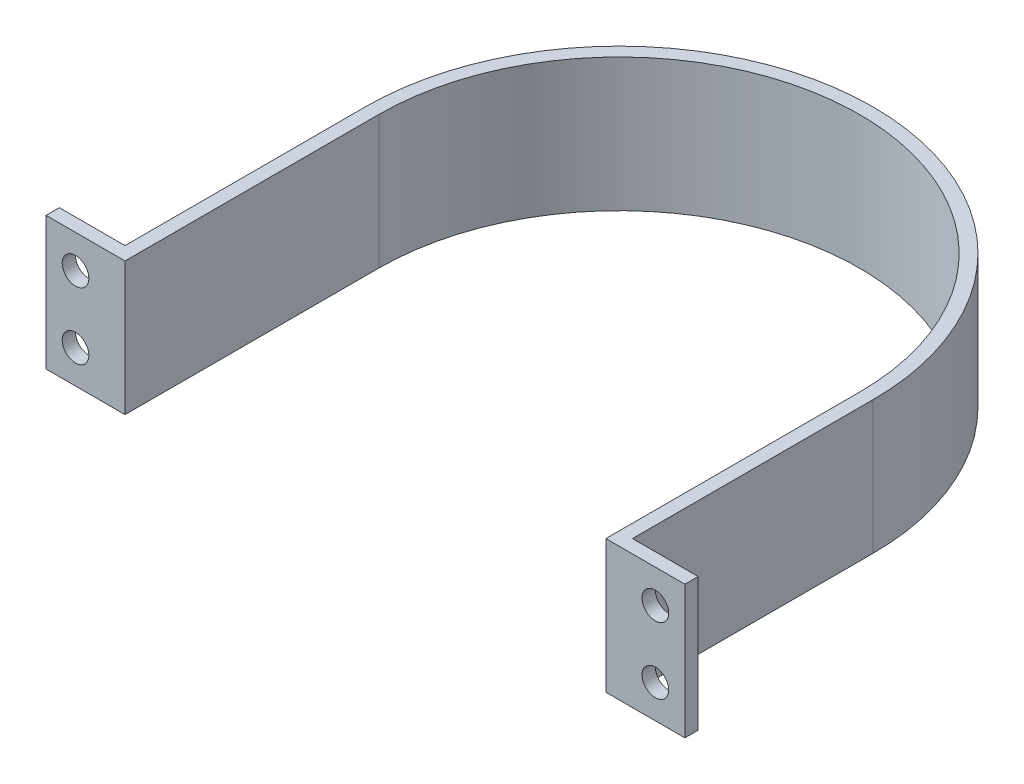
ISO-10303-21;
HEADER;
FILE_DESCRIPTION(('STEP AP214'),'2;1');
FILE_NAME('part.step','',(''),(''),'','','');
FILE_SCHEMA(('AUTOMOTIVE_DESIGN { 1 0 10303 214 1 1 1 1 }'));
ENDSEC;
DATA;
#1=APPLICATION_CONTEXT('core data for automotive mechanical design processes');
#2=APPLICATION_PROTOCOL_DEFINITION('international standard','automotive_design',2000,#1);
#3=PRODUCT_CONTEXT('',#1,'mechanical');
#4=PRODUCT('Part','Part','',(#3));
#5=PRODUCT_RELATED_PRODUCT_CATEGORY('part','',(#4));
#6=PRODUCT_DEFINITION_FORMATION('','',#4);
#7=PRODUCT_DEFINITION_CONTEXT('part definition',#1,'design');
#8=PRODUCT_DEFINITION('design','',#6,#7);
#9=PRODUCT_DEFINITION_SHAPE('','',#8);
#10=(LENGTH_UNIT() NAMED_UNIT(*) SI_UNIT(.MILLI.,.METRE.));
#11=(NAMED_UNIT(*) PLANE_ANGLE_UNIT() SI_UNIT($,.RADIAN.));
#12=(NAMED_UNIT(*) SI_UNIT($,.STERADIAN.) SOLID_ANGLE_UNIT());
#13=UNCERTAINTY_MEASURE_WITH_UNIT(LENGTH_MEASURE(1.E-05),#10,'distance_accuracy_value','');
#14=(GEOMETRIC_REPRESENTATION_CONTEXT(3) GLOBAL_UNCERTAINTY_ASSIGNED_CONTEXT((#13)) GLOBAL_UNIT_ASSIGNED_CONTEXT((#10,
#11,#12)) REPRESENTATION_CONTEXT('',''));
#15=CARTESIAN_POINT('',(0.,0.,0.));
#16=DIRECTION('',(0.,0.,1.));
#17=DIRECTION('',(1.,0.,0.));
#18=AXIS2_PLACEMENT_3D('',#15,#16,#17);
#19=CARTESIAN_POINT('',(0.,31.75,114.7));
#20=DIRECTION('',(0.,0.,1.));
#21=DIRECTION('',(1.,0.,0.));
#22=AXIS2_PLACEMENT_3D('',#19,#20,#21);
#23=PLANE('',#22);
#24=CARTESIAN_POINT('',(-138.3125,15.875,114.7));
#25=DIRECTION('',(0.,0.,1.));
#26=DIRECTION('',(1.,0.,0.));
#27=AXIS2_PLACEMENT_3D('',#24,#25,#26);
#28=CIRCLE('',#27,6.35);
#29=CARTESIAN_POINT('',(-131.9625,15.875,114.7));
#30=VERTEX_POINT('',#29);
#31=EDGE_CURVE('E215',#30,#30,#28,.T.);
#32=ORIENTED_EDGE('',*,*,#31,.T.);
#33=EDGE_LOOP('',(#32));
#34=FACE_BOUND('',#33,.T.);
#35=DIRECTION('',(-1.,0.,0.));
#36=VECTOR('',#35,1.);
#37=CARTESIAN_POINT('',(0.,-31.75,114.7));
#38=LINE('',#37,#36);
#39=CARTESIAN_POINT('',(-121.05,-31.75,114.7));
#40=VERTEX_POINT('',#39);
#41=CARTESIAN_POINT('',(-152.4,-31.75,114.7));
#42=VERTEX_POINT('',#41);
#43=EDGE_CURVE('E162',#40,#42,#38,.T.);
#44=ORIENTED_EDGE('',*,*,#43,.T.);
#45=DIRECTION('',(0.,-1.,0.));
#46=VECTOR('',#45,1.);
#47=CARTESIAN_POINT('',(-152.4,31.75,114.7));
#48=LINE('',#47,#46);
#49=CARTESIAN_POINT('',(-152.4,31.75,114.7));
#50=VERTEX_POINT('',#49);
#51=EDGE_CURVE('E11',#50,#42,#48,.T.);
#52=ORIENTED_EDGE('',*,*,#51,.F.);
#53=DIRECTION('',(-1.,0.,0.));
#54=VECTOR('',#53,1.);
#55=CARTESIAN_POINT('',(0.,31.75,114.7));
#56=LINE('',#55,#54);
#57=CARTESIAN_POINT('',(-121.05,31.75,114.7));
#58=VERTEX_POINT('',#57);
#59=EDGE_CURVE('E192',#58,#50,#56,.T.);
#60=ORIENTED_EDGE('',*,*,#59,.F.);
#61=DIRECTION('',(0.,-1.,0.));
#62=VECTOR('',#61,1.);
#63=CARTESIAN_POINT('',(-121.05,31.75,114.7));
#64=LINE('',#63,#62);
#65=EDGE_CURVE('E161',#58,#40,#64,.T.);
#66=ORIENTED_EDGE('',*,*,#65,.T.);
#67=EDGE_LOOP('',(#44,#52,#60,#66));
#68=FACE_BOUND('',#67,.T.);
#69=CARTESIAN_POINT('',(-138.3125,-15.875,114.7));
#70=DIRECTION('',(0.,0.,1.));
#71=DIRECTION('',(1.,0.,0.));
#72=AXIS2_PLACEMENT_3D('',#69,#70,#71);
#73=CIRCLE('',#72,6.35);
#74=CARTESIAN_POINT('',(-131.9625,-15.875,114.7));
#75=VERTEX_POINT('',#74);
#76=EDGE_CURVE('E166',#75,#75,#73,.F.);
#77=ORIENTED_EDGE('',*,*,#76,.F.);
#78=EDGE_LOOP('',(#77));
#79=FACE_BOUND('',#78,.T.);
#80=ADVANCED_FACE('F38',(#34,#68,#79),#23,.F.);
#81=CARTESIAN_POINT('',(0.,31.75,121.05));
#82=DIRECTION('',(0.,0.,1.));
#83=DIRECTION('',(1.,0.,0.));
#84=AXIS2_PLACEMENT_3D('',#81,#82,#83);
#85=PLANE('',#84);
#86=DIRECTION('',(-1.,0.,0.));
#87=VECTOR('',#86,1.);
#88=CARTESIAN_POINT('',(0.,-31.75,121.05));
#89=LINE('',#88,#87);
#90=CARTESIAN_POINT('',(-114.7,-31.75,121.05));
#91=VERTEX_POINT('',#90);
#92=CARTESIAN_POINT('',(-152.4,-31.75,121.05));
#93=VERTEX_POINT('',#92);
#94=EDGE_CURVE('E169',#91,#93,#89,.T.);
#95=ORIENTED_EDGE('',*,*,#94,.F.);
#96=DIRECTION('',(0.,-1.,0.));
#97=VECTOR('',#96,1.);
#98=CARTESIAN_POINT('',(-114.7,31.75,121.05));
#99=LINE('',#98,#97);
#100=CARTESIAN_POINT('',(-114.7,31.75,121.05));
#101=VERTEX_POINT('',#100);
#102=EDGE_CURVE('E207',#101,#91,#99,.T.);
#103=ORIENTED_EDGE('',*,*,#102,.F.);
#104=DIRECTION('',(-1.,0.,0.));
#105=VECTOR('',#104,1.);
#106=CARTESIAN_POINT('',(0.,31.75,121.05));
#107=LINE('',#106,#105);
#108=CARTESIAN_POINT('',(-152.4,31.75,121.05));
#109=VERTEX_POINT('',#108);
#110=EDGE_CURVE('E234',#101,#109,#107,.T.);
#111=ORIENTED_EDGE('',*,*,#110,.T.);
#112=DIRECTION('',(0.,-1.,0.));
#113=VECTOR('',#112,1.);
#114=CARTESIAN_POINT('',(-152.4,31.75,121.05));
#115=LINE('',#114,#113);
#116=EDGE_CURVE('E47',#109,#93,#115,.T.);
#117=ORIENTED_EDGE('',*,*,#116,.T.);
#118=EDGE_LOOP('',(#95,#103,#111,#117));
#119=FACE_BOUND('',#118,.T.);
#120=CARTESIAN_POINT('',(-138.3125,15.875,121.05));
#121=DIRECTION('',(0.,0.,1.));
#122=DIRECTION('',(1.,0.,0.));
#123=AXIS2_PLACEMENT_3D('',#120,#121,#122);
#124=CIRCLE('',#123,6.35);
#125=CARTESIAN_POINT('',(-131.9625,15.875,121.05));
#126=VERTEX_POINT('',#125);
#127=EDGE_CURVE('E211',#126,#126,#124,.T.);
#128=ORIENTED_EDGE('',*,*,#127,.F.);
#129=EDGE_LOOP('',(#128));
#130=FACE_BOUND('',#129,.T.);
#131=CARTESIAN_POINT('',(-138.3125,-15.875,121.05));
#132=DIRECTION('',(0.,0.,1.));
#133=DIRECTION('',(1.,0.,0.));
#134=AXIS2_PLACEMENT_3D('',#131,#132,#133);
#135=CIRCLE('',#134,6.35);
#136=CARTESIAN_POINT('',(-131.9625,-15.875,121.05));
#137=VERTEX_POINT('',#136);
#138=EDGE_CURVE('E217',#137,#137,#135,.F.);
#139=ORIENTED_EDGE('',*,*,#138,.T.);
#140=EDGE_LOOP('',(#139));
#141=FACE_BOUND('',#140,.T.);
#142=ADVANCED_FACE('F274',(#119,#130,#141),#85,.T.);
#143=CARTESIAN_POINT('',(0.,31.75,121.05));
#144=DIRECTION('',(0.,0.,-1.));
#145=DIRECTION('',(-1.,0.,0.));
#146=AXIS2_PLACEMENT_3D('',#143,#144,#145);
#147=PLANE('',#146);
#148=CARTESIAN_POINT('',(138.3125,-15.875,121.05));
#149=DIRECTION('',(0.,0.,1.));
#150=DIRECTION('',(1.,0.,0.));
#151=AXIS2_PLACEMENT_3D('',#148,#149,#150);
#152=CIRCLE('',#151,6.35);
#153=CARTESIAN_POINT('',(144.6625,-15.875,121.05));
#154=VERTEX_POINT('',#153);
#155=EDGE_CURVE('E222',#154,#154,#152,.T.);
#156=ORIENTED_EDGE('',*,*,#155,.F.);
#157=EDGE_LOOP('',(#156));
#158=FACE_BOUND('',#157,.T.);
#159=DIRECTION('',(1.,0.,0.));
#160=VECTOR('',#159,1.);
#161=CARTESIAN_POINT('',(0.,-31.75,121.05));
#162=LINE('',#161,#160);
#163=CARTESIAN_POINT('',(114.7,-31.75,121.05));
#164=VERTEX_POINT('',#163);
#165=CARTESIAN_POINT('',(152.4,-31.75,121.05));
#166=VERTEX_POINT('',#165);
#167=EDGE_CURVE('E180',#164,#166,#162,.T.);
#168=ORIENTED_EDGE('',*,*,#167,.T.);
#169=DIRECTION('',(0.,-1.,0.));
#170=VECTOR('',#169,1.);
#171=CARTESIAN_POINT('',(152.4,31.75,121.05));
#172=LINE('',#171,#170);
#173=CARTESIAN_POINT('',(152.4,31.75,121.05));
#174=VERTEX_POINT('',#173);
#175=EDGE_CURVE('E198',#174,#166,#172,.T.);
#176=ORIENTED_EDGE('',*,*,#175,.F.);
#177=DIRECTION('',(1.,0.,0.));
#178=VECTOR('',#177,1.);
#179=CARTESIAN_POINT('',(0.,31.75,121.05));
#180=LINE('',#179,#178);
#181=CARTESIAN_POINT('',(114.7,31.75,121.05));
#182=VERTEX_POINT('',#181);
#183=EDGE_CURVE('E245',#182,#174,#180,.T.);
#184=ORIENTED_EDGE('',*,*,#183,.F.);
#185=DIRECTION('',(0.,-1.,0.));
#186=VECTOR('',#185,1.);
#187=CARTESIAN_POINT('',(114.7,31.75,121.05));
#188=LINE('',#187,#186);
#189=EDGE_CURVE('E200',#182,#164,#188,.T.);
#190=ORIENTED_EDGE('',*,*,#189,.T.);
#191=EDGE_LOOP('',(#168,#176,#184,#190));
#192=FACE_BOUND('',#191,.T.);
#193=CARTESIAN_POINT('',(138.3125,15.875,121.05));
#194=DIRECTION('',(0.,0.,1.));
#195=DIRECTION('',(1.,0.,0.));
#196=AXIS2_PLACEMENT_3D('',#193,#194,#195);
#197=CIRCLE('',#196,6.34999999999999);
#198=CARTESIAN_POINT('',(144.6625,15.875,121.05));
#199=VERTEX_POINT('',#198);
#200=EDGE_CURVE('E226',#199,#199,#197,.F.);
#201=ORIENTED_EDGE('',*,*,#200,.T.);
#202=EDGE_LOOP('',(#201));
#203=FACE_BOUND('',#202,.T.);
#204=ADVANCED_FACE('F279',(#158,#192,#203),#147,.F.);
#205=CARTESIAN_POINT('',(0.,31.75,114.7));
#206=DIRECTION('',(0.,0.,-1.));
#207=DIRECTION('',(-1.,0.,0.));
#208=AXIS2_PLACEMENT_3D('',#205,#206,#207);
#209=PLANE('',#208);
#210=DIRECTION('',(1.,0.,0.));
#211=VECTOR('',#210,1.);
#212=CARTESIAN_POINT('',(0.,-31.75,114.7));
#213=LINE('',#212,#211);
#214=CARTESIAN_POINT('',(121.05,-31.75,114.7));
#215=VERTEX_POINT('',#214);
#216=CARTESIAN_POINT('',(152.4,-31.75,114.7));
#217=VERTEX_POINT('',#216);
#218=EDGE_CURVE('E186',#215,#217,#213,.T.);
#219=ORIENTED_EDGE('',*,*,#218,.F.);
#220=DIRECTION('',(0.,-1.,0.));
#221=VECTOR('',#220,1.);
#222=CARTESIAN_POINT('',(121.05,31.75,114.7));
#223=LINE('',#222,#221);
#224=CARTESIAN_POINT('',(121.05,31.75,114.7));
#225=VERTEX_POINT('',#224);
#226=EDGE_CURVE('E144',#225,#215,#223,.T.);
#227=ORIENTED_EDGE('',*,*,#226,.F.);
#228=DIRECTION('',(1.,0.,0.));
#229=VECTOR('',#228,1.);
#230=CARTESIAN_POINT('',(0.,31.75,114.7));
#231=LINE('',#230,#229);
#232=CARTESIAN_POINT('',(152.4,31.75,114.7));
#233=VERTEX_POINT('',#232);
#234=EDGE_CURVE('E154',#225,#233,#231,.T.);
#235=ORIENTED_EDGE('',*,*,#234,.T.);
#236=DIRECTION('',(0.,-1.,0.));
#237=VECTOR('',#236,1.);
#238=CARTESIAN_POINT('',(152.4,31.75,114.7));
#239=LINE('',#238,#237);
#240=EDGE_CURVE('E196',#233,#217,#239,.T.);
#241=ORIENTED_EDGE('',*,*,#240,.T.);
#242=EDGE_LOOP('',(#219,#227,#235,#241));
#243=FACE_BOUND('',#242,.T.);
#244=CARTESIAN_POINT('',(138.3125,-15.875,114.7));
#245=DIRECTION('',(0.,0.,-1.));
#246=DIRECTION('',(-1.,0.,0.));
#247=AXIS2_PLACEMENT_3D('',#244,#245,#246);
#248=CIRCLE('',#247,6.35);
#249=CARTESIAN_POINT('',(131.9625,-15.875,114.7));
#250=VERTEX_POINT('',#249);
#251=EDGE_CURVE('E209',#250,#250,#248,.T.);
#252=ORIENTED_EDGE('',*,*,#251,.F.);
#253=EDGE_LOOP('',(#252));
#254=FACE_BOUND('',#253,.T.);
#255=CARTESIAN_POINT('',(138.3125,15.875,114.7));
#256=DIRECTION('',(0.,0.,-1.));
#257=DIRECTION('',(-1.,0.,0.));
#258=AXIS2_PLACEMENT_3D('',#255,#256,#257);
#259=CIRCLE('',#258,6.34999999999999);
#260=CARTESIAN_POINT('',(131.9625,15.875,114.7));
#261=VERTEX_POINT('',#260);
#262=EDGE_CURVE('E41',#261,#261,#259,.F.);
#263=ORIENTED_EDGE('',*,*,#262,.T.);
#264=EDGE_LOOP('',(#263));
#265=FACE_BOUND('',#264,.T.);
#266=ADVANCED_FACE('F254',(#243,#254,#265),#209,.T.);
#267=CARTESIAN_POINT('',(-152.4,31.75,0.));
#268=DIRECTION('',(1.,0.,0.));
#269=DIRECTION('',(0.,0.,-1.));
#270=AXIS2_PLACEMENT_3D('',#267,#268,#269);
#271=PLANE('',#270);
#272=DIRECTION('',(0.,0.,1.));
#273=VECTOR('',#272,1.);
#274=CARTESIAN_POINT('',(-152.4,-31.75,0.));
#275=LINE('',#274,#273);
#276=EDGE_CURVE('E165',#42,#93,#275,.T.);
#277=ORIENTED_EDGE('',*,*,#276,.T.);
#278=ORIENTED_EDGE('',*,*,#116,.F.);
#279=DIRECTION('',(0.,0.,1.));
#280=VECTOR('',#279,1.);
#281=CARTESIAN_POINT('',(-152.4,31.75,0.));
#282=LINE('',#281,#280);
#283=EDGE_CURVE('E110',#50,#109,#282,.T.);
#284=ORIENTED_EDGE('',*,*,#283,.F.);
#285=ORIENTED_EDGE('',*,*,#51,.T.);
#286=EDGE_LOOP('',(#277,#278,#284,#285));
#287=FACE_BOUND('',#286,.T.);
#288=ADVANCED_FACE('F318',(#287),#271,.F.);
#289=CARTESIAN_POINT('',(-114.7,31.75,0.));
#290=DIRECTION('',(1.,0.,0.));
#291=DIRECTION('',(0.,0.,-1.));
#292=AXIS2_PLACEMENT_3D('',#289,#290,#291);
#293=PLANE('',#292);
#294=DIRECTION('',(0.,0.,1.));
#295=VECTOR('',#294,1.);
#296=CARTESIAN_POINT('',(-114.7,-31.75,0.));
#297=LINE('',#296,#295);
#298=CARTESIAN_POINT('',(-114.7,-31.75,0.));
#299=VERTEX_POINT('',#298);
#300=EDGE_CURVE('E172',#299,#91,#297,.T.);
#301=ORIENTED_EDGE('',*,*,#300,.F.);
#302=DIRECTION('',(0.,-1.,0.));
#303=VECTOR('',#302,1.);
#304=CARTESIAN_POINT('',(-114.7,31.75,0.));
#305=LINE('',#304,#303);
#306=CARTESIAN_POINT('',(-114.7,31.75,0.));
#307=VERTEX_POINT('',#306);
#308=EDGE_CURVE('E205',#307,#299,#305,.T.);
#309=ORIENTED_EDGE('',*,*,#308,.F.);
#310=DIRECTION('',(0.,0.,1.));
#311=VECTOR('',#310,1.);
#312=CARTESIAN_POINT('',(-114.7,31.75,0.));
#313=LINE('',#312,#311);
#314=EDGE_CURVE('E237',#307,#101,#313,.T.);
#315=ORIENTED_EDGE('',*,*,#314,.T.);
#316=ORIENTED_EDGE('',*,*,#102,.T.);
#317=EDGE_LOOP('',(#301,#309,#315,#316));
#318=FACE_BOUND('',#317,.T.);
#319=ADVANCED_FACE('F330',(#318),#293,.T.);
#320=CARTESIAN_POINT('',(0.,31.75,0.));
#321=DIRECTION('',(0.,-1.,0.));
#322=DIRECTION('',(0.,0.,-1.));
#323=AXIS2_PLACEMENT_3D('',#320,#321,#322);
#324=CYLINDRICAL_SURFACE('',#323,114.7);
#325=CARTESIAN_POINT('',(0.,-31.75,0.));
#326=DIRECTION('',(0.,1.,0.));
#327=DIRECTION('',(0.,0.,1.));
#328=AXIS2_PLACEMENT_3D('',#325,#326,#327);
#329=CIRCLE('',#328,114.7);
#330=CARTESIAN_POINT('',(114.7,-31.75,0.));
#331=VERTEX_POINT('',#330);
#332=EDGE_CURVE('E175',#331,#299,#329,.T.);
#333=ORIENTED_EDGE('',*,*,#332,.F.);
#334=DIRECTION('',(0.,-1.,0.));
#335=VECTOR('',#334,1.);
#336=CARTESIAN_POINT('',(114.7,31.75,0.));
#337=LINE('',#336,#335);
#338=CARTESIAN_POINT('',(114.7,31.75,0.));
#339=VERTEX_POINT('',#338);
#340=EDGE_CURVE('E203',#339,#331,#337,.T.);
#341=ORIENTED_EDGE('',*,*,#340,.F.);
#342=CARTESIAN_POINT('',(0.,31.75,0.));
#343=DIRECTION('',(0.,1.,0.));
#344=DIRECTION('',(0.,0.,1.));
#345=AXIS2_PLACEMENT_3D('',#342,#343,#344);
#346=CIRCLE('',#345,114.7);
#347=EDGE_CURVE('E240',#339,#307,#346,.T.);
#348=ORIENTED_EDGE('',*,*,#347,.T.);
#349=ORIENTED_EDGE('',*,*,#308,.T.);
#350=EDGE_LOOP('',(#333,#341,#348,#349));
#351=FACE_BOUND('',#350,.T.);
#352=ADVANCED_FACE('F326',(#351),#324,.F.);
#353=CARTESIAN_POINT('',(114.7,31.75,0.));
#354=DIRECTION('',(1.,0.,0.));
#355=DIRECTION('',(0.,0.,-1.));
#356=AXIS2_PLACEMENT_3D('',#353,#354,#355);
#357=PLANE('',#356);
#358=DIRECTION('',(0.,0.,1.));
#359=VECTOR('',#358,1.);
#360=CARTESIAN_POINT('',(114.7,-31.75,0.));
#361=LINE('',#360,#359);
#362=EDGE_CURVE('E178',#331,#164,#361,.T.);
#363=ORIENTED_EDGE('',*,*,#362,.T.);
#364=ORIENTED_EDGE('',*,*,#189,.F.);
#365=DIRECTION('',(0.,0.,1.));
#366=VECTOR('',#365,1.);
#367=CARTESIAN_POINT('',(114.7,31.75,0.));
#368=LINE('',#367,#366);
#369=EDGE_CURVE('E243',#339,#182,#368,.T.);
#370=ORIENTED_EDGE('',*,*,#369,.F.);
#371=ORIENTED_EDGE('',*,*,#340,.T.);
#372=EDGE_LOOP('',(#363,#364,#370,#371));
#373=FACE_BOUND('',#372,.T.);
#374=ADVANCED_FACE('F323',(#373),#357,.F.);
#375=CARTESIAN_POINT('',(152.4,31.75,0.));
#376=DIRECTION('',(1.,0.,0.));
#377=DIRECTION('',(0.,0.,-1.));
#378=AXIS2_PLACEMENT_3D('',#375,#376,#377);
#379=PLANE('',#378);
#380=DIRECTION('',(0.,0.,1.));
#381=VECTOR('',#380,1.);
#382=CARTESIAN_POINT('',(152.4,-31.75,0.));
#383=LINE('',#382,#381);
#384=EDGE_CURVE('E183',#217,#166,#383,.T.);
#385=ORIENTED_EDGE('',*,*,#384,.F.);
#386=ORIENTED_EDGE('',*,*,#240,.F.);
#387=DIRECTION('',(0.,0.,1.));
#388=VECTOR('',#387,1.);
#389=CARTESIAN_POINT('',(152.4,31.75,0.));
#390=LINE('',#389,#388);
#391=EDGE_CURVE('E156',#233,#174,#390,.T.);
#392=ORIENTED_EDGE('',*,*,#391,.T.);
#393=ORIENTED_EDGE('',*,*,#175,.T.);
#394=EDGE_LOOP('',(#385,#386,#392,#393));
#395=FACE_BOUND('',#394,.T.);
#396=ADVANCED_FACE('F249',(#395),#379,.T.);
#397=CARTESIAN_POINT('',(121.05,31.75,0.));
#398=DIRECTION('',(1.,0.,0.));
#399=DIRECTION('',(0.,0.,-1.));
#400=AXIS2_PLACEMENT_3D('',#397,#398,#399);
#401=PLANE('',#400);
#402=DIRECTION('',(0.,0.,1.));
#403=VECTOR('',#402,1.);
#404=CARTESIAN_POINT('',(121.05,-31.75,0.));
#405=LINE('',#404,#403);
#406=CARTESIAN_POINT('',(121.05,-31.75,0.));
#407=VERTEX_POINT('',#406);
#408=EDGE_CURVE('E143',#407,#215,#405,.T.);
#409=ORIENTED_EDGE('',*,*,#408,.F.);
#410=DIRECTION('',(0.,-1.,0.));
#411=VECTOR('',#410,1.);
#412=CARTESIAN_POINT('',(121.05,31.75,0.));
#413=LINE('',#412,#411);
#414=CARTESIAN_POINT('',(121.05,31.75,0.));
#415=VERTEX_POINT('',#414);
#416=EDGE_CURVE('E137',#415,#407,#413,.T.);
#417=ORIENTED_EDGE('',*,*,#416,.F.);
#418=DIRECTION('',(0.,0.,1.));
#419=VECTOR('',#418,1.);
#420=CARTESIAN_POINT('',(121.05,31.75,0.));
#421=LINE('',#420,#419);
#422=EDGE_CURVE('E141',#415,#225,#421,.T.);
#423=ORIENTED_EDGE('',*,*,#422,.T.);
#424=ORIENTED_EDGE('',*,*,#226,.T.);
#425=EDGE_LOOP('',(#409,#417,#423,#424));
#426=FACE_BOUND('',#425,.T.);
#427=ADVANCED_FACE('F139',(#426),#401,.T.);
#428=CARTESIAN_POINT('',(0.,31.75,0.));
#429=DIRECTION('',(0.,-1.,0.));
#430=DIRECTION('',(0.,0.,-1.));
#431=AXIS2_PLACEMENT_3D('',#428,#429,#430);
#432=CYLINDRICAL_SURFACE('',#431,121.05);
#433=CARTESIAN_POINT('',(0.,-31.75,0.));
#434=DIRECTION('',(0.,1.,0.));
#435=DIRECTION('',(0.,0.,1.));
#436=AXIS2_PLACEMENT_3D('',#433,#434,#435);
#437=CIRCLE('',#436,121.05);
#438=CARTESIAN_POINT('',(-121.05,-31.75,0.));
#439=VERTEX_POINT('',#438);
#440=EDGE_CURVE('E96',#407,#439,#437,.T.);
#441=ORIENTED_EDGE('',*,*,#440,.T.);
#442=DIRECTION('',(0.,-1.,0.));
#443=VECTOR('',#442,1.);
#444=CARTESIAN_POINT('',(-121.05,31.75,0.));
#445=LINE('',#444,#443);
#446=CARTESIAN_POINT('',(-121.05,31.75,0.));
#447=VERTEX_POINT('',#446);
#448=EDGE_CURVE('E145',#447,#439,#445,.T.);
#449=ORIENTED_EDGE('',*,*,#448,.F.);
#450=CARTESIAN_POINT('',(0.,31.75,0.));
#451=DIRECTION('',(0.,1.,0.));
#452=DIRECTION('',(0.,0.,1.));
#453=AXIS2_PLACEMENT_3D('',#450,#451,#452);
#454=CIRCLE('',#453,121.05);
#455=EDGE_CURVE('E147',#415,#447,#454,.T.);
#456=ORIENTED_EDGE('',*,*,#455,.F.);
#457=ORIENTED_EDGE('',*,*,#416,.T.);
#458=EDGE_LOOP('',(#441,#449,#456,#457));
#459=FACE_BOUND('',#458,.T.);
#460=ADVANCED_FACE('F148',(#459),#432,.T.);
#461=CARTESIAN_POINT('',(-121.05,31.75,0.));
#462=DIRECTION('',(1.,0.,0.));
#463=DIRECTION('',(0.,0.,-1.));
#464=AXIS2_PLACEMENT_3D('',#461,#462,#463);
#465=PLANE('',#464);
#466=DIRECTION('',(0.,0.,1.));
#467=VECTOR('',#466,1.);
#468=CARTESIAN_POINT('',(-121.05,-31.75,0.));
#469=LINE('',#468,#467);
#470=EDGE_CURVE('E102',#439,#40,#469,.T.);
#471=ORIENTED_EDGE('',*,*,#470,.T.);
#472=ORIENTED_EDGE('',*,*,#65,.F.);
#473=DIRECTION('',(0.,0.,1.));
#474=VECTOR('',#473,1.);
#475=CARTESIAN_POINT('',(-121.05,31.75,0.));
#476=LINE('',#475,#474);
#477=EDGE_CURVE('E56',#447,#58,#476,.T.);
#478=ORIENTED_EDGE('',*,*,#477,.F.);
#479=ORIENTED_EDGE('',*,*,#448,.T.);
#480=EDGE_LOOP('',(#471,#472,#478,#479));
#481=FACE_BOUND('',#480,.T.);
#482=ADVANCED_FACE('F263',(#481),#465,.F.);
#483=CARTESIAN_POINT('',(0.,31.75,0.));
#484=DIRECTION('',(0.,1.,0.));
#485=DIRECTION('',(0.,0.,1.));
#486=AXIS2_PLACEMENT_3D('',#483,#484,#485);
#487=PLANE('',#486);
#488=ORIENTED_EDGE('',*,*,#59,.T.);
#489=ORIENTED_EDGE('',*,*,#283,.T.);
#490=ORIENTED_EDGE('',*,*,#110,.F.);
#491=ORIENTED_EDGE('',*,*,#314,.F.);
#492=ORIENTED_EDGE('',*,*,#347,.F.);
#493=ORIENTED_EDGE('',*,*,#369,.T.);
#494=ORIENTED_EDGE('',*,*,#183,.T.);
#495=ORIENTED_EDGE('',*,*,#391,.F.);
#496=ORIENTED_EDGE('',*,*,#234,.F.);
#497=ORIENTED_EDGE('',*,*,#422,.F.);
#498=ORIENTED_EDGE('',*,*,#455,.T.);
#499=ORIENTED_EDGE('',*,*,#477,.T.);
#500=EDGE_LOOP('',(#488,#489,#490,#491,#492,#493,#494,#495,#496,#497,#498,#499));
#501=FACE_BOUND('',#500,.T.);
#502=ADVANCED_FACE('F151',(#501),#487,.T.);
#503=CARTESIAN_POINT('',(0.,-31.75,0.));
#504=DIRECTION('',(0.,1.,0.));
#505=DIRECTION('',(0.,0.,1.));
#506=AXIS2_PLACEMENT_3D('',#503,#504,#505);
#507=PLANE('',#506);
#508=ORIENTED_EDGE('',*,*,#43,.F.);
#509=ORIENTED_EDGE('',*,*,#470,.F.);
#510=ORIENTED_EDGE('',*,*,#440,.F.);
#511=ORIENTED_EDGE('',*,*,#408,.T.);
#512=ORIENTED_EDGE('',*,*,#218,.T.);
#513=ORIENTED_EDGE('',*,*,#384,.T.);
#514=ORIENTED_EDGE('',*,*,#167,.F.);
#515=ORIENTED_EDGE('',*,*,#362,.F.);
#516=ORIENTED_EDGE('',*,*,#332,.T.);
#517=ORIENTED_EDGE('',*,*,#300,.T.);
#518=ORIENTED_EDGE('',*,*,#94,.T.);
#519=ORIENTED_EDGE('',*,*,#276,.F.);
#520=EDGE_LOOP('',(#508,#509,#510,#511,#512,#513,#514,#515,#516,#517,#518,#519));
#521=FACE_BOUND('',#520,.T.);
#522=ADVANCED_FACE('F258',(#521),#507,.F.);
#523=CARTESIAN_POINT('',(138.3125,-15.875,-121.05));
#524=DIRECTION('',(0.,0.,1.));
#525=DIRECTION('',(1.,0.,0.));
#526=AXIS2_PLACEMENT_3D('',#523,#524,#525);
#527=CYLINDRICAL_SURFACE('',#526,6.35);
#528=ORIENTED_EDGE('',*,*,#251,.T.);
#529=EDGE_LOOP('',(#528));
#530=FACE_BOUND('',#529,.T.);
#531=ORIENTED_EDGE('',*,*,#155,.T.);
#532=EDGE_LOOP('',(#531));
#533=FACE_BOUND('',#532,.T.);
#534=ADVANCED_FACE('F295',(#530,#533),#527,.F.);
#535=CARTESIAN_POINT('',(138.3125,15.875,-121.05));
#536=DIRECTION('',(0.,0.,1.));
#537=DIRECTION('',(1.,0.,0.));
#538=AXIS2_PLACEMENT_3D('',#535,#536,#537);
#539=CYLINDRICAL_SURFACE('',#538,6.34999999999999);
#540=ORIENTED_EDGE('',*,*,#262,.F.);
#541=EDGE_LOOP('',(#540));
#542=FACE_BOUND('',#541,.T.);
#543=ORIENTED_EDGE('',*,*,#200,.F.);
#544=EDGE_LOOP('',(#543));
#545=FACE_BOUND('',#544,.T.);
#546=ADVANCED_FACE('F287',(#542,#545),#539,.F.);
#547=CARTESIAN_POINT('',(-138.3125,15.875,-121.05));
#548=DIRECTION('',(0.,0.,1.));
#549=DIRECTION('',(1.,0.,0.));
#550=AXIS2_PLACEMENT_3D('',#547,#548,#549);
#551=CYLINDRICAL_SURFACE('',#550,6.35);
#552=ORIENTED_EDGE('',*,*,#127,.T.);
#553=EDGE_LOOP('',(#552));
#554=FACE_BOUND('',#553,.T.);
#555=ORIENTED_EDGE('',*,*,#31,.F.);
#556=EDGE_LOOP('',(#555));
#557=FACE_BOUND('',#556,.T.);
#558=ADVANCED_FACE('F284',(#554,#557),#551,.F.);
#559=CARTESIAN_POINT('',(-138.3125,-15.875,-121.05));
#560=DIRECTION('',(0.,0.,1.));
#561=DIRECTION('',(1.,0.,0.));
#562=AXIS2_PLACEMENT_3D('',#559,#560,#561);
#563=CYLINDRICAL_SURFACE('',#562,6.35);
#564=ORIENTED_EDGE('',*,*,#138,.F.);
#565=EDGE_LOOP('',(#564));
#566=FACE_BOUND('',#565,.T.);
#567=ORIENTED_EDGE('',*,*,#76,.T.);
#568=EDGE_LOOP('',(#567));
#569=FACE_BOUND('',#568,.T.);
#570=ADVANCED_FACE('F286',(#566,#569),#563,.F.);
#571=CLOSED_SHELL('',(#80,#142,#204,#266,#288,#319,#352,#374,#396,#427,#460,#482,#502,#522,#534,
#546,#558,#570));
#572=MANIFOLD_SOLID_BREP('B2',#571);
#573=ADVANCED_BREP_SHAPE_REPRESENTATION('',(#18,#572),#14);
#574=SHAPE_DEFINITION_REPRESENTATION(#9,#573);
ENDSEC;
END-ISO-10303-21;
